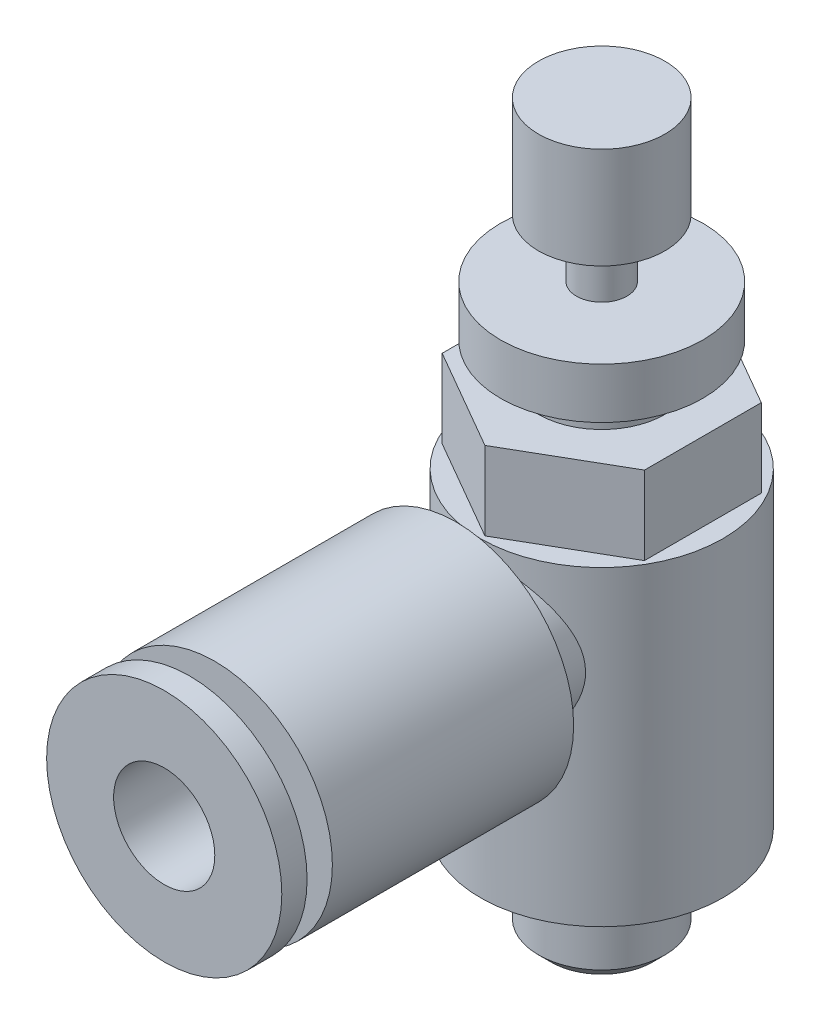
ISO-10303-21;
HEADER;
FILE_DESCRIPTION(('STEP AP214'),'2;1');
FILE_NAME('part.step','',(''),(''),'','','');
FILE_SCHEMA(('AUTOMOTIVE_DESIGN { 1 0 10303 214 1 1 1 1 }'));
ENDSEC;
DATA;
#1=APPLICATION_CONTEXT('core data for automotive mechanical design processes');
#2=APPLICATION_PROTOCOL_DEFINITION('international standard','automotive_design',2000,#1);
#3=PRODUCT_CONTEXT('',#1,'mechanical');
#4=PRODUCT('Part','Part','',(#3));
#5=PRODUCT_RELATED_PRODUCT_CATEGORY('part','',(#4));
#6=PRODUCT_DEFINITION_FORMATION('','',#4);
#7=PRODUCT_DEFINITION_CONTEXT('part definition',#1,'design');
#8=PRODUCT_DEFINITION('design','',#6,#7);
#9=PRODUCT_DEFINITION_SHAPE('','',#8);
#10=(LENGTH_UNIT() NAMED_UNIT(*) SI_UNIT(.MILLI.,.METRE.));
#11=(NAMED_UNIT(*) PLANE_ANGLE_UNIT() SI_UNIT($,.RADIAN.));
#12=(NAMED_UNIT(*) SI_UNIT($,.STERADIAN.) SOLID_ANGLE_UNIT());
#13=UNCERTAINTY_MEASURE_WITH_UNIT(LENGTH_MEASURE(1.E-05),#10,'distance_accuracy_value','');
#14=(GEOMETRIC_REPRESENTATION_CONTEXT(3) GLOBAL_UNCERTAINTY_ASSIGNED_CONTEXT((#13)) GLOBAL_UNIT_ASSIGNED_CONTEXT((#10,
#11,#12)) REPRESENTATION_CONTEXT('',''));
#15=CARTESIAN_POINT('',(0.,0.,0.));
#16=DIRECTION('',(0.,0.,1.));
#17=DIRECTION('',(1.,0.,0.));
#18=AXIS2_PLACEMENT_3D('',#15,#16,#17);
#19=CARTESIAN_POINT('',(0.,12.3,0.));
#20=DIRECTION('',(0.,-1.,0.));
#21=DIRECTION('',(1.,0.,0.));
#22=AXIS2_PLACEMENT_3D('',#19,#20,#21);
#23=CYLINDRICAL_SURFACE('',#22,4.8);
#24=CARTESIAN_POINT('',(3.06,8.7,3.69816170549639));
#25=CARTESIAN_POINT('',(3.06000116814996,8.77571520282919,3.69815984565783));
#26=CARTESIAN_POINT('',(3.05718391961119,8.85141805841028,3.70049787089508));
#27=CARTESIAN_POINT('',(3.04598601883988,9.00214197995387,3.70971917774824));
#28=CARTESIAN_POINT('',(3.03760348855489,9.07716280709386,3.71660399371383));
#29=CARTESIAN_POINT('',(3.00427888315889,9.30042026747253,3.7436849891774));
#30=CARTESIAN_POINT('',(2.97116007917715,9.44675041198889,3.77030709978425));
#31=CARTESIAN_POINT('',(2.88558608003435,9.72889720377223,3.83617209939865));
#32=CARTESIAN_POINT('',(2.83330043399501,9.86479376833843,3.87530395072));
#33=CARTESIAN_POINT('',(2.71138035262218,10.1257496062436,3.96156500161356));
#34=CARTESIAN_POINT('',(2.64174236502615,10.2508066535105,4.00869583805709));
#35=CARTESIAN_POINT('',(2.47571446778348,10.505744205697,4.11360644071567));
#36=CARTESIAN_POINT('',(2.37694222350978,10.6338406450674,4.17195259540191));
#37=CARTESIAN_POINT('',(2.160344907012,10.8731565021248,4.28813165881457));
#38=CARTESIAN_POINT('',(2.0425033501924,10.9843611548844,4.34596407739539));
#39=CARTESIAN_POINT('',(1.77278374780058,11.2008649849486,4.46334167285235));
#40=CARTESIAN_POINT('',(1.6184819940157,11.3036058638819,4.5221660088638));
#41=CARTESIAN_POINT('',(1.37261996798434,11.4364618879994,4.60036602442494));
#42=CARTESIAN_POINT('',(1.28823850295367,11.4772131918114,4.6247654249611));
#43=CARTESIAN_POINT('',(1.11519726015687,11.5510988604854,4.6695068202388));
#44=CARTESIAN_POINT('',(1.02654055772161,11.5842386045679,4.68985167904107));
#45=CARTESIAN_POINT('',(0.855106180025624,11.6393258291268,4.7239412081766));
#46=CARTESIAN_POINT('',(0.772679626904835,11.6620801026587,4.73815292947818));
#47=CARTESIAN_POINT('',(0.605663553561513,11.7006852022662,4.76238232293443));
#48=CARTESIAN_POINT('',(0.521075336327766,11.7165400878127,4.77240246120347));
#49=CARTESIAN_POINT('',(0.350505560692182,11.7410788136296,4.7879503967297));
#50=CARTESIAN_POINT('',(0.264524964037434,11.7497674050358,4.79348117032356));
#51=CARTESIAN_POINT('',(0.0919949635774968,11.7598392548145,4.799896417211));
#52=CARTESIAN_POINT('',(0.00544563068154372,11.7612234072185,4.80078145912178));
#53=CARTESIAN_POINT('',(-0.229628387285397,11.754980773317,4.79679779420684));
#54=CARTESIAN_POINT('',(-0.377968400658311,11.7401591607635,4.78733434898072));
#55=CARTESIAN_POINT('',(-0.669453864072689,11.6895428723316,4.75535429784877));
#56=CARTESIAN_POINT('',(-0.812598923073388,11.653746621088,4.73283671147273));
#57=CARTESIAN_POINT('',(-1.0903809162502,11.5628733379459,4.67666209286539));
#58=CARTESIAN_POINT('',(-1.22501126511798,11.5077815930151,4.64299656127134));
#59=CARTESIAN_POINT('',(-1.48318251730864,11.3803953765521,4.56708956496122));
#60=CARTESIAN_POINT('',(-1.60672105169748,11.3080972421455,4.52484627450421));
#61=CARTESIAN_POINT('',(-1.85601643627265,11.1381066590508,4.42890711258397));
#62=CARTESIAN_POINT('',(-1.98007059708912,11.038357198989,4.3744383106023));
#63=CARTESIAN_POINT('',(-2.21076669360591,10.8216072533148,4.26251039291976));
#64=CARTESIAN_POINT('',(-2.31738215045438,10.7045810380231,4.20504690136701));
#65=CARTESIAN_POINT('',(-2.52517208551546,10.437684560971,4.08409660539884));
#66=CARTESIAN_POINT('',(-2.62356479106587,10.2855104597436,4.02087306887523));
#67=CARTESIAN_POINT('',(-2.79308888524605,9.96304415730239,3.90502516512039));
#68=CARTESIAN_POINT('',(-2.86426978889757,9.79278559150438,3.85238162997342));
#69=CARTESIAN_POINT('',(-2.96053524876098,9.48566449944128,3.77860708545028));
#70=CARTESIAN_POINT('',(-2.99287808014132,9.35220722789266,3.75280486508323));
#71=CARTESIAN_POINT('',(-3.03939430463369,9.0803091362847,3.71523971062755));
#72=CARTESIAN_POINT('',(-3.05359446718722,8.94187596917963,3.70345609391357));
#73=CARTESIAN_POINT('',(-3.06295812987872,8.66351258215373,3.69571848081816));
#74=CARTESIAN_POINT('',(-3.05806774156609,8.52357923797078,3.69980929428863));
#75=CARTESIAN_POINT('',(-3.02947039609055,8.24691343691903,3.72325472133775));
#76=CARTESIAN_POINT('',(-3.00574770127343,8.11018375569396,3.74262210104717));
#77=CARTESIAN_POINT('',(-2.94171179828993,7.84685541415419,3.7931411833471));
#78=CARTESIAN_POINT('',(-2.90183292677099,7.72008806464131,3.82398276756878));
#79=CARTESIAN_POINT('',(-2.8070989864156,7.47480503846028,3.89405431722738));
#80=CARTESIAN_POINT('',(-2.75223892840275,7.35629212729464,3.93328707622743));
#81=CARTESIAN_POINT('',(-2.61686274764303,7.10639912855663,4.02491311500293));
#82=CARTESIAN_POINT('',(-2.53343271330401,6.97699342755043,4.07838232942177));
#83=CARTESIAN_POINT('',(-2.3486696698667,6.73254909655642,4.18751607129412));
#84=CARTESIAN_POINT('',(-2.24731546746751,6.61752775235908,4.2431831362591));
#85=CARTESIAN_POINT('',(-2.00845355683362,6.38434029130558,4.36198366865362));
#86=CARTESIAN_POINT('',(-1.86772198081525,6.26922431965486,4.42469363167985));
#87=CARTESIAN_POINT('',(-1.56536332270102,6.06438391568468,4.54045697916981));
#88=CARTESIAN_POINT('',(-1.40375973492364,5.97463129018364,4.5935210621196));
#89=CARTESIAN_POINT('',(-1.09746596446211,5.83970370162884,4.67497933344098));
#90=CARTESIAN_POINT('',(-0.955870072691531,5.78920098758188,4.70618585849712));
#91=CARTESIAN_POINT('',(-0.664747399722079,5.70927386381106,4.75603370661514));
#92=CARTESIAN_POINT('',(-0.515227051763178,5.67983262915278,4.7746850586554));
#93=CARTESIAN_POINT('',(-0.211869639343732,5.64351281521851,4.79774047352796));
#94=CARTESIAN_POINT('',(-0.0580204253556333,5.63670583975482,4.80209932120927));
#95=CARTESIAN_POINT('',(0.24866900891189,5.64626439756347,4.79600742531606));
#96=CARTESIAN_POINT('',(0.401509140425295,5.66263194284773,4.78555539586109));
#97=CARTESIAN_POINT('',(0.693965080065919,5.71620612665908,4.7517392333584));
#98=CARTESIAN_POINT('',(0.833860473910688,5.75233510806269,4.72904359623912));
#99=CARTESIAN_POINT('',(1.1052632025344,5.8429944126268,4.67307315342478));
#100=CARTESIAN_POINT('',(1.23676917071821,5.8975277247055,4.63979662941292));
#101=CARTESIAN_POINT('',(1.49884834016556,6.02790228142563,4.56218688703618));
#102=CARTESIAN_POINT('',(1.62856690066346,6.10506280654558,4.51719872790336));
#103=CARTESIAN_POINT('',(1.87386986889879,6.27623848517405,4.42108615939338));
#104=CARTESIAN_POINT('',(1.98944274646304,6.37026723610915,4.36995681069152));
#105=CARTESIAN_POINT('',(2.22161804629609,6.58880057636072,4.25716865799356));
#106=CARTESIAN_POINT('',(2.33570644204159,6.71576507067082,4.19509071654141));
#107=CARTESIAN_POINT('',(2.5418156381634,6.98772598791123,4.07351124260103));
#108=CARTESIAN_POINT('',(2.63383049408627,7.13272725225501,4.01401040766058));
#109=CARTESIAN_POINT('',(2.78185953201405,7.41677702708684,3.9125584293077));
#110=CARTESIAN_POINT('',(2.84115780710051,7.55364541876593,3.86931363094275));
#111=CARTESIAN_POINT('',(2.93971178323861,7.83738782651236,3.79498976343556));
#112=CARTESIAN_POINT('',(2.97902030909503,7.98423429666451,3.76387868110636));
#113=CARTESIAN_POINT('',(3.02467543963146,8.22688737270305,3.72717295599717));
#114=CARTESIAN_POINT('',(3.0378820453434,8.3206641966941,3.71636816056215));
#115=CARTESIAN_POINT('',(3.05554388836118,8.50963378634001,3.70186346308068));
#116=CARTESIAN_POINT('',(3.05999853164565,8.6048266476637,3.6981640432973));
#117=CARTESIAN_POINT('',(3.06,8.7,3.69816170549639));
#118=B_SPLINE_CURVE_WITH_KNOTS('',3,(#24,#25,#26,#27,#28,#29,#30,#31,#32,#33,#34,#35,#36,#37,
#38,#39,#40,#41,#42,#43,#44,#45,#46,#47,#48,#49,#50,#51,#52,#53,#54,#55,#56,#57,#58,#59,#60,#61,
#62,#63,#64,#65,#66,#67,#68,#69,#70,#71,#72,#73,#74,#75,#76,#77,#78,#79,#80,#81,#82,#83,#84,#85,
#86,#87,#88,#89,#90,#91,#92,#93,#94,#95,#96,#97,#98,#99,#100,#101,#102,#103,#104,#105,#106,#107,
#108,#109,#110,#111,#112,#113,#114,#115,#116,#117),.UNSPECIFIED.,.T.,.F.,(4,2,2,2,2,2,2,2,2,2,2,
2,2,2,2,2,2,2,2,2,2,2,2,2,2,2,2,2,2,2,2,2,2,2,2,2,2,2,2,2,2,2,2,2,2,2,4),(0.,0.227029628584687,
0.454135909247905,0.908648035166309,1.35923293896706,1.80991015957308,2.32380492237934,
2.83814632170744,3.41802990697131,3.7081357512645,3.99803593754812,4.25770289856233,
4.51721686912904,4.7765586475636,5.0358686829606,5.48163226253271,5.92742932684651,
6.37356705918261,6.81979984983824,7.32257953125244,7.82611568314475,8.39914751889619,
8.97113163684455,9.38857911022957,9.80540992736071,10.2234182163933,10.6417761919476,
11.0495635383288,11.4574868558766,11.9446736250278,12.4324403364783,13.0065841470675,
13.5800872224026,14.0387356755687,14.4970173276472,14.9567473881244,15.4165173648134,
15.8534055683627,16.2903647580297,16.7610340761204,17.2320845182701,17.7747390687814,
18.317539593728,18.7817150423787,19.2446574048484,19.5300123089211,19.8153865801995),.UNSPECIFIED.);
#119=CARTESIAN_POINT('',(3.06,8.7,3.69816170549639));
#120=VERTEX_POINT('',#119);
#121=EDGE_CURVE('E11',#120,#120,#118,.T.);
#122=ORIENTED_EDGE('',*,*,#121,.F.);
#123=EDGE_LOOP('',(#122));
#124=FACE_BOUND('',#123,.T.);
#125=CARTESIAN_POINT('',(0.,0.,0.));
#126=DIRECTION('',(0.,-1.,0.));
#127=DIRECTION('',(1.,0.,0.));
#128=AXIS2_PLACEMENT_3D('',#125,#126,#127);
#129=CIRCLE('',#128,4.8);
#130=CARTESIAN_POINT('',(4.8,0.,0.));
#131=VERTEX_POINT('',#130);
#132=EDGE_CURVE('E201',#131,#131,#129,.T.);
#133=ORIENTED_EDGE('',*,*,#132,.F.);
#134=EDGE_LOOP('',(#133));
#135=FACE_BOUND('',#134,.T.);
#136=CARTESIAN_POINT('',(0.,12.3,0.));
#137=DIRECTION('',(0.,1.,0.));
#138=DIRECTION('',(0.,0.,1.));
#139=AXIS2_PLACEMENT_3D('',#136,#137,#138);
#140=CIRCLE('',#139,4.8);
#141=CARTESIAN_POINT('',(0.,12.3,4.8));
#142=VERTEX_POINT('',#141);
#143=EDGE_CURVE('E101',#142,#142,#140,.T.);
#144=ORIENTED_EDGE('',*,*,#143,.F.);
#145=EDGE_LOOP('',(#144));
#146=FACE_BOUND('',#145,.T.);
#147=ADVANCED_FACE('F36',(#124,#135,#146),#23,.T.);
#148=CARTESIAN_POINT('',(0.,-3.6,0.));
#149=DIRECTION('',(0.,1.,0.));
#150=DIRECTION('',(-1.,0.,0.));
#151=AXIS2_PLACEMENT_3D('',#148,#149,#150);
#152=PLANE('',#151);
#153=CARTESIAN_POINT('',(0.,-3.6,0.));
#154=DIRECTION('',(0.,-1.,0.));
#155=DIRECTION('',(1.,0.,0.));
#156=AXIS2_PLACEMENT_3D('',#153,#154,#155);
#157=CIRCLE('',#156,2.0095);
#158=CARTESIAN_POINT('',(2.0095,-3.6,0.));
#159=VERTEX_POINT('',#158);
#160=EDGE_CURVE('E49',#159,#159,#157,.T.);
#161=ORIENTED_EDGE('',*,*,#160,.T.);
#162=EDGE_LOOP('',(#161));
#163=FACE_BOUND('',#162,.T.);
#164=ADVANCED_FACE('F38',(#163),#152,.F.);
#165=CARTESIAN_POINT('',(0.,-3.1095,0.));
#166=DIRECTION('',(0.,1.,0.));
#167=DIRECTION('',(-1.,0.,0.));
#168=AXIS2_PLACEMENT_3D('',#165,#166,#167);
#169=CONICAL_SURFACE('',#168,2.5,0.785398163397449);
#170=ORIENTED_EDGE('',*,*,#160,.F.);
#171=EDGE_LOOP('',(#170));
#172=FACE_BOUND('',#171,.T.);
#173=CARTESIAN_POINT('',(0.,-3.1095,0.));
#174=DIRECTION('',(0.,-1.,0.));
#175=DIRECTION('',(1.,0.,0.));
#176=AXIS2_PLACEMENT_3D('',#173,#174,#175);
#177=CIRCLE('',#176,2.5);
#178=CARTESIAN_POINT('',(2.5,-3.1095,0.));
#179=VERTEX_POINT('',#178);
#180=EDGE_CURVE('E210',#179,#179,#177,.T.);
#181=ORIENTED_EDGE('',*,*,#180,.T.);
#182=EDGE_LOOP('',(#181));
#183=FACE_BOUND('',#182,.T.);
#184=ADVANCED_FACE('F216',(#172,#183),#169,.T.);
#185=CARTESIAN_POINT('',(0.,12.3,0.));
#186=DIRECTION('',(0.,-1.,0.));
#187=DIRECTION('',(1.,0.,0.));
#188=AXIS2_PLACEMENT_3D('',#185,#186,#187);
#189=CYLINDRICAL_SURFACE('',#188,2.5);
#190=ORIENTED_EDGE('',*,*,#180,.F.);
#191=EDGE_LOOP('',(#190));
#192=FACE_BOUND('',#191,.T.);
#193=CARTESIAN_POINT('',(0.,-0.4905,0.));
#194=DIRECTION('',(0.,-1.,0.));
#195=DIRECTION('',(1.,0.,0.));
#196=AXIS2_PLACEMENT_3D('',#193,#194,#195);
#197=CIRCLE('',#196,2.5);
#198=CARTESIAN_POINT('',(2.5,-0.4905,0.));
#199=VERTEX_POINT('',#198);
#200=EDGE_CURVE('E207',#199,#199,#197,.T.);
#201=ORIENTED_EDGE('',*,*,#200,.T.);
#202=EDGE_LOOP('',(#201));
#203=FACE_BOUND('',#202,.T.);
#204=ADVANCED_FACE('F219',(#192,#203),#189,.T.);
#205=CARTESIAN_POINT('',(0.,0.,0.));
#206=DIRECTION('',(0.,-1.,0.));
#207=DIRECTION('',(1.,0.,0.));
#208=AXIS2_PLACEMENT_3D('',#205,#206,#207);
#209=CONICAL_SURFACE('',#208,2.0095,0.785398163397449);
#210=ORIENTED_EDGE('',*,*,#200,.F.);
#211=EDGE_LOOP('',(#210));
#212=FACE_BOUND('',#211,.T.);
#213=CARTESIAN_POINT('',(0.,0.,0.));
#214=DIRECTION('',(0.,-1.,0.));
#215=DIRECTION('',(1.,0.,0.));
#216=AXIS2_PLACEMENT_3D('',#213,#214,#215);
#217=CIRCLE('',#216,2.0095);
#218=CARTESIAN_POINT('',(2.0095,0.,0.));
#219=VERTEX_POINT('',#218);
#220=EDGE_CURVE('E204',#219,#219,#217,.T.);
#221=ORIENTED_EDGE('',*,*,#220,.T.);
#222=EDGE_LOOP('',(#221));
#223=FACE_BOUND('',#222,.T.);
#224=ADVANCED_FACE('F224',(#212,#223),#209,.T.);
#225=CARTESIAN_POINT('',(-2.0095,0.,0.));
#226=DIRECTION('',(0.,1.,0.));
#227=DIRECTION('',(-1.,0.,0.));
#228=AXIS2_PLACEMENT_3D('',#225,#226,#227);
#229=PLANE('',#228);
#230=ORIENTED_EDGE('',*,*,#220,.F.);
#231=EDGE_LOOP('',(#230));
#232=FACE_BOUND('',#231,.T.);
#233=ORIENTED_EDGE('',*,*,#132,.T.);
#234=EDGE_LOOP('',(#233));
#235=FACE_BOUND('',#234,.T.);
#236=ADVANCED_FACE('F230',(#232,#235),#229,.F.);
#237=CARTESIAN_POINT('',(0.,8.7,0.));
#238=DIRECTION('',(0.,0.,1.));
#239=DIRECTION('',(1.,0.,0.));
#240=AXIS2_PLACEMENT_3D('',#237,#238,#239);
#241=CYLINDRICAL_SURFACE('',#240,3.06);
#242=CARTESIAN_POINT('',(0.,8.7,5.76000000000001));
#243=DIRECTION('',(0.,0.,1.));
#244=DIRECTION('',(1.,0.,0.));
#245=AXIS2_PLACEMENT_3D('',#242,#243,#244);
#246=CIRCLE('',#245,3.06);
#247=CARTESIAN_POINT('',(3.06,8.7,5.76000000000001));
#248=VERTEX_POINT('',#247);
#249=EDGE_CURVE('E178',#248,#248,#246,.T.);
#250=ORIENTED_EDGE('',*,*,#249,.F.);
#251=EDGE_LOOP('',(#250));
#252=FACE_BOUND('',#251,.T.);
#253=ORIENTED_EDGE('',*,*,#121,.T.);
#254=EDGE_LOOP('',(#253));
#255=FACE_BOUND('',#254,.T.);
#256=ADVANCED_FACE('F236',(#252,#255),#241,.T.);
#257=CARTESIAN_POINT('',(0.,8.7,17.3));
#258=DIRECTION('',(0.,0.,-1.));
#259=DIRECTION('',(-1.,0.,0.));
#260=AXIS2_PLACEMENT_3D('',#257,#258,#259);
#261=PLANE('',#260);
#262=CARTESIAN_POINT('',(0.,8.7,17.3));
#263=DIRECTION('',(0.,0.,1.));
#264=DIRECTION('',(1.,0.,0.));
#265=AXIS2_PLACEMENT_3D('',#262,#263,#264);
#266=CIRCLE('',#265,2.);
#267=CARTESIAN_POINT('',(2.,8.7,17.3));
#268=VERTEX_POINT('',#267);
#269=EDGE_CURVE('E174',#268,#268,#266,.T.);
#270=ORIENTED_EDGE('',*,*,#269,.F.);
#271=EDGE_LOOP('',(#270));
#272=FACE_BOUND('',#271,.T.);
#273=CARTESIAN_POINT('',(0.,8.7,17.3));
#274=DIRECTION('',(0.,0.,1.));
#275=DIRECTION('',(1.,0.,0.));
#276=AXIS2_PLACEMENT_3D('',#273,#274,#275);
#277=CIRCLE('',#276,4.64999999999999);
#278=CARTESIAN_POINT('',(4.64999999999999,8.7,17.3));
#279=VERTEX_POINT('',#278);
#280=EDGE_CURVE('E198',#279,#279,#277,.T.);
#281=ORIENTED_EDGE('',*,*,#280,.T.);
#282=EDGE_LOOP('',(#281));
#283=FACE_BOUND('',#282,.T.);
#284=ADVANCED_FACE('F318',(#272,#283),#261,.F.);
#285=CARTESIAN_POINT('',(0.,8.7,0.));
#286=DIRECTION('',(0.,0.,1.));
#287=DIRECTION('',(1.,0.,0.));
#288=AXIS2_PLACEMENT_3D('',#285,#286,#287);
#289=CYLINDRICAL_SURFACE('',#288,4.64999999999999);
#290=ORIENTED_EDGE('',*,*,#280,.F.);
#291=EDGE_LOOP('',(#290));
#292=FACE_BOUND('',#291,.T.);
#293=CARTESIAN_POINT('',(0.,8.7,16.3));
#294=DIRECTION('',(0.,0.,1.));
#295=DIRECTION('',(1.,0.,0.));
#296=AXIS2_PLACEMENT_3D('',#293,#294,#295);
#297=CIRCLE('',#296,4.64999999999999);
#298=CARTESIAN_POINT('',(4.64999999999999,8.7,16.3));
#299=VERTEX_POINT('',#298);
#300=EDGE_CURVE('E195',#299,#299,#297,.T.);
#301=ORIENTED_EDGE('',*,*,#300,.T.);
#302=EDGE_LOOP('',(#301));
#303=FACE_BOUND('',#302,.T.);
#304=ADVANCED_FACE('F338',(#292,#303),#289,.T.);
#305=CARTESIAN_POINT('',(0.,13.35,16.3));
#306=DIRECTION('',(0.,0.,1.));
#307=DIRECTION('',(1.,0.,0.));
#308=AXIS2_PLACEMENT_3D('',#305,#306,#307);
#309=PLANE('',#308);
#310=ORIENTED_EDGE('',*,*,#300,.F.);
#311=EDGE_LOOP('',(#310));
#312=FACE_BOUND('',#311,.T.);
#313=CARTESIAN_POINT('',(0.,8.7,16.3));
#314=DIRECTION('',(0.,0.,1.));
#315=DIRECTION('',(1.,0.,0.));
#316=AXIS2_PLACEMENT_3D('',#313,#314,#315);
#317=CIRCLE('',#316,2.99999999999999);
#318=CARTESIAN_POINT('',(2.99999999999999,8.7,16.3));
#319=VERTEX_POINT('',#318);
#320=EDGE_CURVE('E192',#319,#319,#317,.T.);
#321=ORIENTED_EDGE('',*,*,#320,.T.);
#322=EDGE_LOOP('',(#321));
#323=FACE_BOUND('',#322,.T.);
#324=ADVANCED_FACE('F334',(#312,#323),#309,.F.);
#325=CARTESIAN_POINT('',(0.,8.7,0.));
#326=DIRECTION('',(0.,0.,1.));
#327=DIRECTION('',(1.,0.,0.));
#328=AXIS2_PLACEMENT_3D('',#325,#326,#327);
#329=CYLINDRICAL_SURFACE('',#328,3.);
#330=ORIENTED_EDGE('',*,*,#320,.F.);
#331=EDGE_LOOP('',(#330));
#332=FACE_BOUND('',#331,.T.);
#333=CARTESIAN_POINT('',(0.,8.7,15.3));
#334=DIRECTION('',(0.,0.,1.));
#335=DIRECTION('',(1.,0.,0.));
#336=AXIS2_PLACEMENT_3D('',#333,#334,#335);
#337=CIRCLE('',#336,3.);
#338=CARTESIAN_POINT('',(3.,8.7,15.3));
#339=VERTEX_POINT('',#338);
#340=EDGE_CURVE('E189',#339,#339,#337,.T.);
#341=ORIENTED_EDGE('',*,*,#340,.T.);
#342=EDGE_LOOP('',(#341));
#343=FACE_BOUND('',#342,.T.);
#344=ADVANCED_FACE('F330',(#332,#343),#329,.T.);
#345=CARTESIAN_POINT('',(0.,11.7,15.3));
#346=DIRECTION('',(0.,0.,-1.));
#347=DIRECTION('',(-1.,0.,0.));
#348=AXIS2_PLACEMENT_3D('',#345,#346,#347);
#349=PLANE('',#348);
#350=ORIENTED_EDGE('',*,*,#340,.F.);
#351=EDGE_LOOP('',(#350));
#352=FACE_BOUND('',#351,.T.);
#353=CARTESIAN_POINT('',(0.,8.7,15.3));
#354=DIRECTION('',(0.,0.,1.));
#355=DIRECTION('',(1.,0.,0.));
#356=AXIS2_PLACEMENT_3D('',#353,#354,#355);
#357=CIRCLE('',#356,4.64999999999999);
#358=CARTESIAN_POINT('',(4.64999999999999,8.7,15.3));
#359=VERTEX_POINT('',#358);
#360=EDGE_CURVE('E186',#359,#359,#357,.T.);
#361=ORIENTED_EDGE('',*,*,#360,.T.);
#362=EDGE_LOOP('',(#361));
#363=FACE_BOUND('',#362,.T.);
#364=ADVANCED_FACE('F326',(#352,#363),#349,.F.);
#365=CARTESIAN_POINT('',(0.,8.7,0.));
#366=DIRECTION('',(0.,0.,1.));
#367=DIRECTION('',(1.,0.,0.));
#368=AXIS2_PLACEMENT_3D('',#365,#366,#367);
#369=CYLINDRICAL_SURFACE('',#368,4.64999999999999);
#370=ORIENTED_EDGE('',*,*,#360,.F.);
#371=EDGE_LOOP('',(#370));
#372=FACE_BOUND('',#371,.T.);
#373=CARTESIAN_POINT('',(0.,8.7,5.76));
#374=DIRECTION('',(0.,0.,1.));
#375=DIRECTION('',(1.,0.,0.));
#376=AXIS2_PLACEMENT_3D('',#373,#374,#375);
#377=CIRCLE('',#376,4.64999999999999);
#378=CARTESIAN_POINT('',(4.64999999999999,8.7,5.76));
#379=VERTEX_POINT('',#378);
#380=EDGE_CURVE('E183',#379,#379,#377,.T.);
#381=ORIENTED_EDGE('',*,*,#380,.T.);
#382=EDGE_LOOP('',(#381));
#383=FACE_BOUND('',#382,.T.);
#384=ADVANCED_FACE('F322',(#372,#383),#369,.T.);
#385=CARTESIAN_POINT('',(0.,13.35,5.76000000000001));
#386=DIRECTION('',(0.,0.,1.));
#387=DIRECTION('',(1.,0.,0.));
#388=AXIS2_PLACEMENT_3D('',#385,#386,#387);
#389=PLANE('',#388);
#390=ORIENTED_EDGE('',*,*,#380,.F.);
#391=EDGE_LOOP('',(#390));
#392=FACE_BOUND('',#391,.T.);
#393=ORIENTED_EDGE('',*,*,#249,.T.);
#394=EDGE_LOOP('',(#393));
#395=FACE_BOUND('',#394,.T.);
#396=ADVANCED_FACE('F313',(#392,#395),#389,.F.);
#397=CARTESIAN_POINT('',(0.,8.7,4.6));
#398=DIRECTION('',(0.,0.,1.));
#399=DIRECTION('',(1.,0.,0.));
#400=AXIS2_PLACEMENT_3D('',#397,#398,#399);
#401=CYLINDRICAL_SURFACE('',#400,2.);
#402=CARTESIAN_POINT('',(0.,8.7,4.6));
#403=DIRECTION('',(0.,0.,1.));
#404=DIRECTION('',(1.,0.,0.));
#405=AXIS2_PLACEMENT_3D('',#402,#403,#404);
#406=CIRCLE('',#405,2.);
#407=CARTESIAN_POINT('',(2.,8.7,4.6));
#408=VERTEX_POINT('',#407);
#409=EDGE_CURVE('E175',#408,#408,#406,.T.);
#410=ORIENTED_EDGE('',*,*,#409,.F.);
#411=EDGE_LOOP('',(#410));
#412=FACE_BOUND('',#411,.T.);
#413=ORIENTED_EDGE('',*,*,#269,.T.);
#414=EDGE_LOOP('',(#413));
#415=FACE_BOUND('',#414,.T.);
#416=ADVANCED_FACE('F310',(#412,#415),#401,.F.);
#417=CARTESIAN_POINT('',(0.,8.7,4.6));
#418=DIRECTION('',(0.,0.,1.));
#419=DIRECTION('',(1.,0.,0.));
#420=AXIS2_PLACEMENT_3D('',#417,#418,#419);
#421=PLANE('',#420);
#422=ORIENTED_EDGE('',*,*,#409,.T.);
#423=EDGE_LOOP('',(#422));
#424=FACE_BOUND('',#423,.T.);
#425=ADVANCED_FACE('F248',(#424),#421,.T.);
#426=CARTESIAN_POINT('',(0.,12.3,0.));
#427=DIRECTION('',(0.,1.,0.));
#428=DIRECTION('',(0.,0.,1.));
#429=AXIS2_PLACEMENT_3D('',#426,#427,#428);
#430=PLANE('',#429);
#431=ORIENTED_EDGE('',*,*,#143,.T.);
#432=EDGE_LOOP('',(#431));
#433=FACE_BOUND('',#432,.T.);
#434=DIRECTION('',(-0.866025403784439,0.,0.5));
#435=VECTOR('',#434,1.);
#436=CARTESIAN_POINT('',(0.,12.3,-4.61880215351701));
#437=LINE('',#436,#435);
#438=CARTESIAN_POINT('',(0.,12.3,-4.61880215351701));
#439=VERTEX_POINT('',#438);
#440=CARTESIAN_POINT('',(-4.,12.3,-2.3094010767585));
#441=VERTEX_POINT('',#440);
#442=EDGE_CURVE('E98',#439,#441,#437,.T.);
#443=ORIENTED_EDGE('',*,*,#442,.F.);
#444=DIRECTION('',(-0.866025403784439,0.,-0.5));
#445=VECTOR('',#444,1.);
#446=CARTESIAN_POINT('',(4.,12.3,-2.3094010767585));
#447=LINE('',#446,#445);
#448=CARTESIAN_POINT('',(4.,12.3,-2.3094010767585));
#449=VERTEX_POINT('',#448);
#450=EDGE_CURVE('E117',#449,#439,#447,.T.);
#451=ORIENTED_EDGE('',*,*,#450,.F.);
#452=DIRECTION('',(0.,0.,-1.));
#453=VECTOR('',#452,1.);
#454=CARTESIAN_POINT('',(4.,12.3,2.3094010767585));
#455=LINE('',#454,#453);
#456=CARTESIAN_POINT('',(4.,12.3,2.3094010767585));
#457=VERTEX_POINT('',#456);
#458=EDGE_CURVE('E120',#457,#449,#455,.T.);
#459=ORIENTED_EDGE('',*,*,#458,.F.);
#460=DIRECTION('',(0.866025403784439,0.,-0.5));
#461=VECTOR('',#460,1.);
#462=CARTESIAN_POINT('',(0.,12.3,4.61880215351701));
#463=LINE('',#462,#461);
#464=CARTESIAN_POINT('',(0.,12.3,4.61880215351701));
#465=VERTEX_POINT('',#464);
#466=EDGE_CURVE('E137',#465,#457,#463,.T.);
#467=ORIENTED_EDGE('',*,*,#466,.F.);
#468=DIRECTION('',(0.866025403784439,0.,0.5));
#469=VECTOR('',#468,1.);
#470=CARTESIAN_POINT('',(-4.,12.3,2.3094010767585));
#471=LINE('',#470,#469);
#472=CARTESIAN_POINT('',(-4.,12.3,2.3094010767585));
#473=VERTEX_POINT('',#472);
#474=EDGE_CURVE('E134',#473,#465,#471,.T.);
#475=ORIENTED_EDGE('',*,*,#474,.F.);
#476=DIRECTION('',(0.,0.,1.));
#477=VECTOR('',#476,1.);
#478=CARTESIAN_POINT('',(-4.,12.3,-2.3094010767585));
#479=LINE('',#478,#477);
#480=EDGE_CURVE('E132',#441,#473,#479,.T.);
#481=ORIENTED_EDGE('',*,*,#480,.F.);
#482=EDGE_LOOP('',(#443,#451,#459,#467,#475,#481));
#483=FACE_BOUND('',#482,.T.);
#484=ADVANCED_FACE('F245',(#433,#483),#430,.T.);
#485=CARTESIAN_POINT('',(0.,15.4,-4.61880215351701));
#486=DIRECTION('',(0.5,0.,0.866025403784439));
#487=DIRECTION('',(0.866025403784439,0.,-0.5));
#488=AXIS2_PLACEMENT_3D('',#485,#486,#487);
#489=PLANE('',#488);
#490=ORIENTED_EDGE('',*,*,#442,.T.);
#491=DIRECTION('',(0.,-1.,0.));
#492=VECTOR('',#491,1.);
#493=CARTESIAN_POINT('',(-4.,15.4,-2.3094010767585));
#494=LINE('',#493,#492);
#495=CARTESIAN_POINT('',(-4.,15.4,-2.3094010767585));
#496=VERTEX_POINT('',#495);
#497=EDGE_CURVE('E95',#496,#441,#494,.T.);
#498=ORIENTED_EDGE('',*,*,#497,.F.);
#499=DIRECTION('',(-0.866025403784439,0.,0.5));
#500=VECTOR('',#499,1.);
#501=CARTESIAN_POINT('',(0.,15.4,-4.61880215351701));
#502=LINE('',#501,#500);
#503=CARTESIAN_POINT('',(0.,15.4,-4.61880215351701));
#504=VERTEX_POINT('',#503);
#505=EDGE_CURVE('E56',#504,#496,#502,.T.);
#506=ORIENTED_EDGE('',*,*,#505,.F.);
#507=DIRECTION('',(0.,-1.,0.));
#508=VECTOR('',#507,1.);
#509=CARTESIAN_POINT('',(0.,15.4,-4.61880215351701));
#510=LINE('',#509,#508);
#511=EDGE_CURVE('E130',#504,#439,#510,.T.);
#512=ORIENTED_EDGE('',*,*,#511,.T.);
#513=EDGE_LOOP('',(#490,#498,#506,#512));
#514=FACE_BOUND('',#513,.T.);
#515=ADVANCED_FACE('F97',(#514),#489,.F.);
#516=CARTESIAN_POINT('',(-4.,15.4,-2.3094010767585));
#517=DIRECTION('',(1.,0.,0.));
#518=DIRECTION('',(0.,0.,-1.));
#519=AXIS2_PLACEMENT_3D('',#516,#517,#518);
#520=PLANE('',#519);
#521=ORIENTED_EDGE('',*,*,#480,.T.);
#522=DIRECTION('',(0.,-1.,0.));
#523=VECTOR('',#522,1.);
#524=CARTESIAN_POINT('',(-4.,15.4,2.3094010767585));
#525=LINE('',#524,#523);
#526=CARTESIAN_POINT('',(-4.,15.4,2.3094010767585));
#527=VERTEX_POINT('',#526);
#528=EDGE_CURVE('E102',#527,#473,#525,.T.);
#529=ORIENTED_EDGE('',*,*,#528,.F.);
#530=DIRECTION('',(0.,0.,1.));
#531=VECTOR('',#530,1.);
#532=CARTESIAN_POINT('',(-4.,15.4,-2.3094010767585));
#533=LINE('',#532,#531);
#534=EDGE_CURVE('E105',#496,#527,#533,.T.);
#535=ORIENTED_EDGE('',*,*,#534,.F.);
#536=ORIENTED_EDGE('',*,*,#497,.T.);
#537=EDGE_LOOP('',(#521,#529,#535,#536));
#538=FACE_BOUND('',#537,.T.);
#539=ADVANCED_FACE('F106',(#538),#520,.F.);
#540=CARTESIAN_POINT('',(-4.,15.4,2.3094010767585));
#541=DIRECTION('',(0.5,0.,-0.866025403784439));
#542=DIRECTION('',(-0.866025403784439,0.,-0.5));
#543=AXIS2_PLACEMENT_3D('',#540,#541,#542);
#544=PLANE('',#543);
#545=ORIENTED_EDGE('',*,*,#474,.T.);
#546=DIRECTION('',(0.,-1.,0.));
#547=VECTOR('',#546,1.);
#548=CARTESIAN_POINT('',(0.,15.4,4.61880215351701));
#549=LINE('',#548,#547);
#550=CARTESIAN_POINT('',(0.,15.4,4.61880215351701));
#551=VERTEX_POINT('',#550);
#552=EDGE_CURVE('E145',#551,#465,#549,.T.);
#553=ORIENTED_EDGE('',*,*,#552,.F.);
#554=DIRECTION('',(0.866025403784439,0.,0.5));
#555=VECTOR('',#554,1.);
#556=CARTESIAN_POINT('',(-4.,15.4,2.3094010767585));
#557=LINE('',#556,#555);
#558=EDGE_CURVE('E110',#527,#551,#557,.T.);
#559=ORIENTED_EDGE('',*,*,#558,.F.);
#560=ORIENTED_EDGE('',*,*,#528,.T.);
#561=EDGE_LOOP('',(#545,#553,#559,#560));
#562=FACE_BOUND('',#561,.T.);
#563=ADVANCED_FACE('F261',(#562),#544,.F.);
#564=CARTESIAN_POINT('',(0.,15.4,4.61880215351701));
#565=DIRECTION('',(-0.5,0.,-0.866025403784439));
#566=DIRECTION('',(-0.866025403784439,0.,0.5));
#567=AXIS2_PLACEMENT_3D('',#564,#565,#566);
#568=PLANE('',#567);
#569=ORIENTED_EDGE('',*,*,#466,.T.);
#570=DIRECTION('',(0.,-1.,0.));
#571=VECTOR('',#570,1.);
#572=CARTESIAN_POINT('',(4.,15.4,2.3094010767585));
#573=LINE('',#572,#571);
#574=CARTESIAN_POINT('',(4.,15.4,2.3094010767585));
#575=VERTEX_POINT('',#574);
#576=EDGE_CURVE('E143',#575,#457,#573,.T.);
#577=ORIENTED_EDGE('',*,*,#576,.F.);
#578=DIRECTION('',(0.866025403784439,0.,-0.5));
#579=VECTOR('',#578,1.);
#580=CARTESIAN_POINT('',(0.,15.4,4.61880215351701));
#581=LINE('',#580,#579);
#582=EDGE_CURVE('E124',#551,#575,#581,.T.);
#583=ORIENTED_EDGE('',*,*,#582,.F.);
#584=ORIENTED_EDGE('',*,*,#552,.T.);
#585=EDGE_LOOP('',(#569,#577,#583,#584));
#586=FACE_BOUND('',#585,.T.);
#587=ADVANCED_FACE('F259',(#586),#568,.F.);
#588=CARTESIAN_POINT('',(4.,15.4,2.3094010767585));
#589=DIRECTION('',(-1.,0.,0.));
#590=DIRECTION('',(0.,0.,1.));
#591=AXIS2_PLACEMENT_3D('',#588,#589,#590);
#592=PLANE('',#591);
#593=ORIENTED_EDGE('',*,*,#458,.T.);
#594=DIRECTION('',(0.,-1.,0.));
#595=VECTOR('',#594,1.);
#596=CARTESIAN_POINT('',(4.,15.4,-2.3094010767585));
#597=LINE('',#596,#595);
#598=CARTESIAN_POINT('',(4.,15.4,-2.3094010767585));
#599=VERTEX_POINT('',#598);
#600=EDGE_CURVE('E64',#599,#449,#597,.T.);
#601=ORIENTED_EDGE('',*,*,#600,.F.);
#602=DIRECTION('',(0.,0.,-1.));
#603=VECTOR('',#602,1.);
#604=CARTESIAN_POINT('',(4.,15.4,2.3094010767585));
#605=LINE('',#604,#603);
#606=EDGE_CURVE('E127',#575,#599,#605,.T.);
#607=ORIENTED_EDGE('',*,*,#606,.F.);
#608=ORIENTED_EDGE('',*,*,#576,.T.);
#609=EDGE_LOOP('',(#593,#601,#607,#608));
#610=FACE_BOUND('',#609,.T.);
#611=ADVANCED_FACE('F256',(#610),#592,.F.);
#612=CARTESIAN_POINT('',(4.,15.4,-2.3094010767585));
#613=DIRECTION('',(-0.5,0.,0.866025403784439));
#614=DIRECTION('',(0.866025403784439,0.,0.5));
#615=AXIS2_PLACEMENT_3D('',#612,#613,#614);
#616=PLANE('',#615);
#617=ORIENTED_EDGE('',*,*,#450,.T.);
#618=ORIENTED_EDGE('',*,*,#511,.F.);
#619=DIRECTION('',(-0.866025403784439,0.,-0.5));
#620=VECTOR('',#619,1.);
#621=CARTESIAN_POINT('',(4.,15.4,-2.3094010767585));
#622=LINE('',#621,#620);
#623=EDGE_CURVE('E116',#599,#504,#622,.T.);
#624=ORIENTED_EDGE('',*,*,#623,.F.);
#625=ORIENTED_EDGE('',*,*,#600,.T.);
#626=EDGE_LOOP('',(#617,#618,#624,#625));
#627=FACE_BOUND('',#626,.T.);
#628=ADVANCED_FACE('F254',(#627),#616,.F.);
#629=CARTESIAN_POINT('',(0.,25.,0.));
#630=DIRECTION('',(0.,-1.,0.));
#631=DIRECTION('',(0.,0.,-1.));
#632=AXIS2_PLACEMENT_3D('',#629,#630,#631);
#633=PLANE('',#632);
#634=CARTESIAN_POINT('',(0.,25.,0.));
#635=DIRECTION('',(0.,1.,0.));
#636=DIRECTION('',(0.,0.,1.));
#637=AXIS2_PLACEMENT_3D('',#634,#635,#636);
#638=CIRCLE('',#637,2.5);
#639=CARTESIAN_POINT('',(0.,25.,2.5));
#640=VERTEX_POINT('',#639);
#641=EDGE_CURVE('E171',#640,#640,#638,.T.);
#642=ORIENTED_EDGE('',*,*,#641,.T.);
#643=EDGE_LOOP('',(#642));
#644=FACE_BOUND('',#643,.T.);
#645=ADVANCED_FACE('F303',(#644),#633,.F.);
#646=CARTESIAN_POINT('',(0.,12.3,0.));
#647=DIRECTION('',(0.,1.,0.));
#648=DIRECTION('',(0.,0.,1.));
#649=AXIS2_PLACEMENT_3D('',#646,#647,#648);
#650=CYLINDRICAL_SURFACE('',#649,2.5);
#651=ORIENTED_EDGE('',*,*,#641,.F.);
#652=EDGE_LOOP('',(#651));
#653=FACE_BOUND('',#652,.T.);
#654=CARTESIAN_POINT('',(0.,21.,0.));
#655=DIRECTION('',(0.,1.,0.));
#656=DIRECTION('',(0.,0.,1.));
#657=AXIS2_PLACEMENT_3D('',#654,#655,#656);
#658=CIRCLE('',#657,2.5);
#659=CARTESIAN_POINT('',(0.,21.,2.5));
#660=VERTEX_POINT('',#659);
#661=EDGE_CURVE('E168',#660,#660,#658,.T.);
#662=ORIENTED_EDGE('',*,*,#661,.T.);
#663=EDGE_LOOP('',(#662));
#664=FACE_BOUND('',#663,.T.);
#665=ADVANCED_FACE('F299',(#653,#664),#650,.T.);
#666=CARTESIAN_POINT('',(2.5,21.,0.));
#667=DIRECTION('',(0.,1.,0.));
#668=DIRECTION('',(0.,0.,1.));
#669=AXIS2_PLACEMENT_3D('',#666,#667,#668);
#670=PLANE('',#669);
#671=ORIENTED_EDGE('',*,*,#661,.F.);
#672=EDGE_LOOP('',(#671));
#673=FACE_BOUND('',#672,.T.);
#674=CARTESIAN_POINT('',(0.,21.,0.));
#675=DIRECTION('',(0.,1.,0.));
#676=DIRECTION('',(0.,0.,1.));
#677=AXIS2_PLACEMENT_3D('',#674,#675,#676);
#678=CIRCLE('',#677,1.);
#679=CARTESIAN_POINT('',(0.,21.,1.));
#680=VERTEX_POINT('',#679);
#681=EDGE_CURVE('E165',#680,#680,#678,.T.);
#682=ORIENTED_EDGE('',*,*,#681,.T.);
#683=EDGE_LOOP('',(#682));
#684=FACE_BOUND('',#683,.T.);
#685=ADVANCED_FACE('F295',(#673,#684),#670,.F.);
#686=CARTESIAN_POINT('',(0.,12.3,0.));
#687=DIRECTION('',(0.,1.,0.));
#688=DIRECTION('',(0.,0.,1.));
#689=AXIS2_PLACEMENT_3D('',#686,#687,#688);
#690=CYLINDRICAL_SURFACE('',#689,1.);
#691=ORIENTED_EDGE('',*,*,#681,.F.);
#692=EDGE_LOOP('',(#691));
#693=FACE_BOUND('',#692,.T.);
#694=CARTESIAN_POINT('',(0.,18.7,0.));
#695=DIRECTION('',(0.,1.,0.));
#696=DIRECTION('',(0.,0.,1.));
#697=AXIS2_PLACEMENT_3D('',#694,#695,#696);
#698=CIRCLE('',#697,1.);
#699=CARTESIAN_POINT('',(0.,18.7,1.));
#700=VERTEX_POINT('',#699);
#701=EDGE_CURVE('E162',#700,#700,#698,.T.);
#702=ORIENTED_EDGE('',*,*,#701,.T.);
#703=EDGE_LOOP('',(#702));
#704=FACE_BOUND('',#703,.T.);
#705=ADVANCED_FACE('F291',(#693,#704),#690,.T.);
#706=CARTESIAN_POINT('',(1.,18.7,0.));
#707=DIRECTION('',(0.,-1.,0.));
#708=DIRECTION('',(0.,0.,-1.));
#709=AXIS2_PLACEMENT_3D('',#706,#707,#708);
#710=PLANE('',#709);
#711=ORIENTED_EDGE('',*,*,#701,.F.);
#712=EDGE_LOOP('',(#711));
#713=FACE_BOUND('',#712,.T.);
#714=CARTESIAN_POINT('',(0.,18.7,0.));
#715=DIRECTION('',(0.,1.,0.));
#716=DIRECTION('',(0.,0.,1.));
#717=AXIS2_PLACEMENT_3D('',#714,#715,#716);
#718=CIRCLE('',#717,4.);
#719=CARTESIAN_POINT('',(0.,18.7,4.));
#720=VERTEX_POINT('',#719);
#721=EDGE_CURVE('E159',#720,#720,#718,.T.);
#722=ORIENTED_EDGE('',*,*,#721,.T.);
#723=EDGE_LOOP('',(#722));
#724=FACE_BOUND('',#723,.T.);
#725=ADVANCED_FACE('F287',(#713,#724),#710,.F.);
#726=CARTESIAN_POINT('',(0.,12.3,0.));
#727=DIRECTION('',(0.,1.,0.));
#728=DIRECTION('',(0.,0.,1.));
#729=AXIS2_PLACEMENT_3D('',#726,#727,#728);
#730=CYLINDRICAL_SURFACE('',#729,4.);
#731=ORIENTED_EDGE('',*,*,#721,.F.);
#732=EDGE_LOOP('',(#731));
#733=FACE_BOUND('',#732,.T.);
#734=CARTESIAN_POINT('',(0.,16.7,0.));
#735=DIRECTION('',(0.,1.,0.));
#736=DIRECTION('',(0.,0.,1.));
#737=AXIS2_PLACEMENT_3D('',#734,#735,#736);
#738=CIRCLE('',#737,4.);
#739=CARTESIAN_POINT('',(0.,16.7,4.));
#740=VERTEX_POINT('',#739);
#741=EDGE_CURVE('E156',#740,#740,#738,.T.);
#742=ORIENTED_EDGE('',*,*,#741,.T.);
#743=EDGE_LOOP('',(#742));
#744=FACE_BOUND('',#743,.T.);
#745=ADVANCED_FACE('F283',(#733,#744),#730,.T.);
#746=CARTESIAN_POINT('',(4.,16.7,0.));
#747=DIRECTION('',(0.,1.,0.));
#748=DIRECTION('',(0.,0.,1.));
#749=AXIS2_PLACEMENT_3D('',#746,#747,#748);
#750=PLANE('',#749);
#751=ORIENTED_EDGE('',*,*,#741,.F.);
#752=EDGE_LOOP('',(#751));
#753=FACE_BOUND('',#752,.T.);
#754=CARTESIAN_POINT('',(0.,16.7,0.));
#755=DIRECTION('',(0.,1.,0.));
#756=DIRECTION('',(0.,0.,1.));
#757=AXIS2_PLACEMENT_3D('',#754,#755,#756);
#758=CIRCLE('',#757,2.5);
#759=CARTESIAN_POINT('',(0.,16.7,2.5));
#760=VERTEX_POINT('',#759);
#761=EDGE_CURVE('E153',#760,#760,#758,.T.);
#762=ORIENTED_EDGE('',*,*,#761,.T.);
#763=EDGE_LOOP('',(#762));
#764=FACE_BOUND('',#763,.T.);
#765=ADVANCED_FACE('F279',(#753,#764),#750,.F.);
#766=CARTESIAN_POINT('',(0.,12.3,0.));
#767=DIRECTION('',(0.,1.,0.));
#768=DIRECTION('',(0.,0.,1.));
#769=AXIS2_PLACEMENT_3D('',#766,#767,#768);
#770=CYLINDRICAL_SURFACE('',#769,2.5);
#771=ORIENTED_EDGE('',*,*,#761,.F.);
#772=EDGE_LOOP('',(#771));
#773=FACE_BOUND('',#772,.T.);
#774=CARTESIAN_POINT('',(0.,15.4,0.));
#775=DIRECTION('',(0.,1.,0.));
#776=DIRECTION('',(0.,0.,1.));
#777=AXIS2_PLACEMENT_3D('',#774,#775,#776);
#778=CIRCLE('',#777,2.5);
#779=CARTESIAN_POINT('',(0.,15.4,2.5));
#780=VERTEX_POINT('',#779);
#781=EDGE_CURVE('E150',#780,#780,#778,.T.);
#782=ORIENTED_EDGE('',*,*,#781,.T.);
#783=EDGE_LOOP('',(#782));
#784=FACE_BOUND('',#783,.T.);
#785=ADVANCED_FACE('F276',(#773,#784),#770,.T.);
#786=CARTESIAN_POINT('',(2.5,15.4,0.));
#787=DIRECTION('',(0.,-1.,0.));
#788=DIRECTION('',(0.,0.,-1.));
#789=AXIS2_PLACEMENT_3D('',#786,#787,#788);
#790=PLANE('',#789);
#791=ORIENTED_EDGE('',*,*,#623,.T.);
#792=ORIENTED_EDGE('',*,*,#505,.T.);
#793=ORIENTED_EDGE('',*,*,#534,.T.);
#794=ORIENTED_EDGE('',*,*,#558,.T.);
#795=ORIENTED_EDGE('',*,*,#582,.T.);
#796=ORIENTED_EDGE('',*,*,#606,.T.);
#797=EDGE_LOOP('',(#791,#792,#793,#794,#795,#796));
#798=FACE_BOUND('',#797,.T.);
#799=ORIENTED_EDGE('',*,*,#781,.F.);
#800=EDGE_LOOP('',(#799));
#801=FACE_BOUND('',#800,.T.);
#802=ADVANCED_FACE('F113',(#798,#801),#790,.F.);
#803=CLOSED_SHELL('',(#147,#164,#184,#204,#224,#236,#256,#284,#304,#324,#344,#364,#384,#396,
#416,#425,#484,#515,#539,#563,#587,#611,#628,#645,#665,#685,#705,#725,#745,#765,#785,#802));
#804=MANIFOLD_SOLID_BREP('B2',#803);
#805=ADVANCED_BREP_SHAPE_REPRESENTATION('',(#18,#804),#14);
#806=SHAPE_DEFINITION_REPRESENTATION(#9,#805);
ENDSEC;
END-ISO-10303-21;
